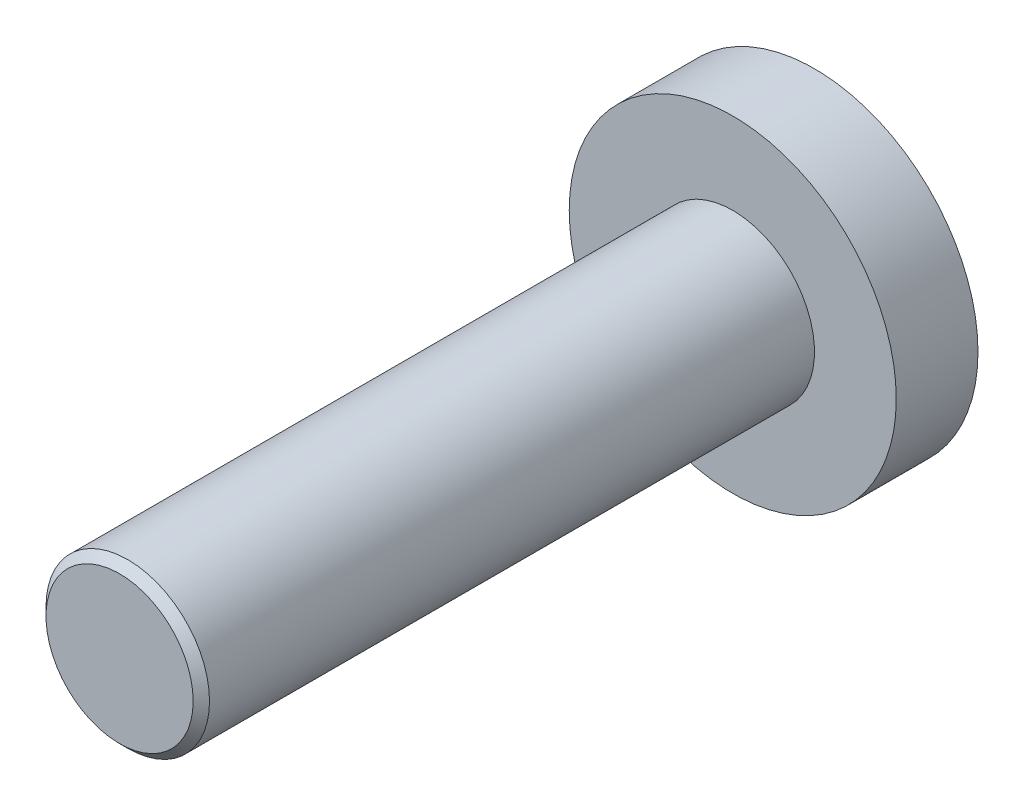
ISO-10303-21;
HEADER;
FILE_DESCRIPTION(('STEP AP214'),'2;1');
FILE_NAME('part.step','',(''),(''),'','','');
FILE_SCHEMA(('AUTOMOTIVE_DESIGN { 1 0 10303 214 1 1 1 1 }'));
ENDSEC;
DATA;
#1=APPLICATION_CONTEXT('core data for automotive mechanical design processes');
#2=APPLICATION_PROTOCOL_DEFINITION('international standard','automotive_design',2000,#1);
#3=PRODUCT_CONTEXT('',#1,'mechanical');
#4=PRODUCT('Part','Part','',(#3));
#5=PRODUCT_RELATED_PRODUCT_CATEGORY('part','',(#4));
#6=PRODUCT_DEFINITION_FORMATION('','',#4);
#7=PRODUCT_DEFINITION_CONTEXT('part definition',#1,'design');
#8=PRODUCT_DEFINITION('design','',#6,#7);
#9=PRODUCT_DEFINITION_SHAPE('','',#8);
#10=(LENGTH_UNIT() NAMED_UNIT(*) SI_UNIT(.MILLI.,.METRE.));
#11=(NAMED_UNIT(*) PLANE_ANGLE_UNIT() SI_UNIT($,.RADIAN.));
#12=(NAMED_UNIT(*) SI_UNIT($,.STERADIAN.) SOLID_ANGLE_UNIT());
#13=UNCERTAINTY_MEASURE_WITH_UNIT(LENGTH_MEASURE(1.E-05),#10,'distance_accuracy_value','');
#14=(GEOMETRIC_REPRESENTATION_CONTEXT(3) GLOBAL_UNCERTAINTY_ASSIGNED_CONTEXT((#13)) GLOBAL_UNIT_ASSIGNED_CONTEXT((#10,
#11,#12)) REPRESENTATION_CONTEXT('',''));
#15=CARTESIAN_POINT('',(0.,0.,0.));
#16=DIRECTION('',(0.,0.,1.));
#17=DIRECTION('',(1.,0.,0.));
#18=AXIS2_PLACEMENT_3D('',#15,#16,#17);
#19=CARTESIAN_POINT('',(0.,0.,15.));
#20=DIRECTION('',(0.,0.,-1.));
#21=DIRECTION('',(-1.,0.,0.));
#22=AXIS2_PLACEMENT_3D('',#19,#20,#21);
#23=CYLINDRICAL_SURFACE('',#22,2.);
#24=CARTESIAN_POINT('',(0.,0.,14.8));
#25=DIRECTION('',(0.,0.,1.));
#26=DIRECTION('',(1.,0.,0.));
#27=AXIS2_PLACEMENT_3D('',#24,#25,#26);
#28=CIRCLE('',#27,2.);
#29=CARTESIAN_POINT('',(2.,0.,14.8));
#30=VERTEX_POINT('',#29);
#31=EDGE_CURVE('E10',#30,#30,#28,.F.);
#32=ORIENTED_EDGE('',*,*,#31,.T.);
#33=EDGE_LOOP('',(#32));
#34=FACE_BOUND('',#33,.T.);
#35=CARTESIAN_POINT('',(0.,0.,0.));
#36=DIRECTION('',(0.,0.,-1.));
#37=DIRECTION('',(-1.,0.,0.));
#38=AXIS2_PLACEMENT_3D('',#35,#36,#37);
#39=CIRCLE('',#38,2.);
#40=CARTESIAN_POINT('',(-2.,0.,0.));
#41=VERTEX_POINT('',#40);
#42=EDGE_CURVE('E41',#41,#41,#39,.T.);
#43=ORIENTED_EDGE('',*,*,#42,.F.);
#44=EDGE_LOOP('',(#43));
#45=FACE_BOUND('',#44,.T.);
#46=ADVANCED_FACE('F30',(#34,#45),#23,.T.);
#47=CARTESIAN_POINT('',(0.,0.,15.));
#48=DIRECTION('',(0.,0.,1.));
#49=DIRECTION('',(1.,0.,0.));
#50=AXIS2_PLACEMENT_3D('',#47,#48,#49);
#51=PLANE('',#50);
#52=CARTESIAN_POINT('',(0.,0.,15.));
#53=DIRECTION('',(0.,0.,1.));
#54=DIRECTION('',(1.,0.,0.));
#55=AXIS2_PLACEMENT_3D('',#52,#53,#54);
#56=CIRCLE('',#55,1.8);
#57=CARTESIAN_POINT('',(1.8,0.,15.));
#58=VERTEX_POINT('',#57);
#59=EDGE_CURVE('E37',#58,#58,#56,.T.);
#60=ORIENTED_EDGE('',*,*,#59,.T.);
#61=EDGE_LOOP('',(#60));
#62=FACE_BOUND('',#61,.T.);
#63=ADVANCED_FACE('F65',(#62),#51,.T.);
#64=CARTESIAN_POINT('',(0.,0.,0.));
#65=DIRECTION('',(0.,0.,-1.));
#66=DIRECTION('',(-1.,0.,0.));
#67=AXIS2_PLACEMENT_3D('',#64,#65,#66);
#68=PLANE('',#67);
#69=CARTESIAN_POINT('',(0.,0.,0.));
#70=DIRECTION('',(0.,0.,-1.));
#71=DIRECTION('',(-1.,0.,0.));
#72=AXIS2_PLACEMENT_3D('',#69,#70,#71);
#73=CIRCLE('',#72,4.);
#74=CARTESIAN_POINT('',(-4.,0.,0.));
#75=VERTEX_POINT('',#74);
#76=EDGE_CURVE('E48',#75,#75,#73,.T.);
#77=ORIENTED_EDGE('',*,*,#76,.F.);
#78=EDGE_LOOP('',(#77));
#79=FACE_BOUND('',#78,.T.);
#80=ORIENTED_EDGE('',*,*,#42,.T.);
#81=EDGE_LOOP('',(#80));
#82=FACE_BOUND('',#81,.T.);
#83=ADVANCED_FACE('F59',(#79,#82),#68,.F.);
#84=CARTESIAN_POINT('',(0.,0.,-2.));
#85=DIRECTION('',(0.,0.,1.));
#86=DIRECTION('',(1.,0.,0.));
#87=AXIS2_PLACEMENT_3D('',#84,#85,#86);
#88=CYLINDRICAL_SURFACE('',#87,4.);
#89=CARTESIAN_POINT('',(0.,0.,-2.));
#90=DIRECTION('',(0.,0.,-1.));
#91=DIRECTION('',(-1.,0.,0.));
#92=AXIS2_PLACEMENT_3D('',#89,#90,#91);
#93=CIRCLE('',#92,4.);
#94=CARTESIAN_POINT('',(-4.,0.,-2.));
#95=VERTEX_POINT('',#94);
#96=EDGE_CURVE('E45',#95,#95,#93,.T.);
#97=ORIENTED_EDGE('',*,*,#96,.F.);
#98=EDGE_LOOP('',(#97));
#99=FACE_BOUND('',#98,.T.);
#100=ORIENTED_EDGE('',*,*,#76,.T.);
#101=EDGE_LOOP('',(#100));
#102=FACE_BOUND('',#101,.T.);
#103=ADVANCED_FACE('F56',(#99,#102),#88,.T.);
#104=CARTESIAN_POINT('',(0.,0.,-2.));
#105=DIRECTION('',(0.,0.,-1.));
#106=DIRECTION('',(-1.,0.,0.));
#107=AXIS2_PLACEMENT_3D('',#104,#105,#106);
#108=PLANE('',#107);
#109=ORIENTED_EDGE('',*,*,#96,.T.);
#110=EDGE_LOOP('',(#109));
#111=FACE_BOUND('',#110,.T.);
#112=ADVANCED_FACE('F54',(#111),#108,.T.);
#113=CARTESIAN_POINT('',(0.,0.,15.));
#114=DIRECTION('',(0.,0.,-1.));
#115=DIRECTION('',(-1.,0.,0.));
#116=AXIS2_PLACEMENT_3D('',#113,#114,#115);
#117=CONICAL_SURFACE('',#116,1.8,0.785398163397435);
#118=ORIENTED_EDGE('',*,*,#31,.F.);
#119=EDGE_LOOP('',(#118));
#120=FACE_BOUND('',#119,.T.);
#121=ORIENTED_EDGE('',*,*,#59,.F.);
#122=EDGE_LOOP('',(#121));
#123=FACE_BOUND('',#122,.T.);
#124=ADVANCED_FACE('F32',(#120,#123),#117,.T.);
#125=CLOSED_SHELL('',(#46,#63,#83,#103,#112,#124));
#126=MANIFOLD_SOLID_BREP('B2',#125);
#127=ADVANCED_BREP_SHAPE_REPRESENTATION('',(#18,#126),#14);
#128=SHAPE_DEFINITION_REPRESENTATION(#9,#127);
ENDSEC;
END-ISO-10303-21;
